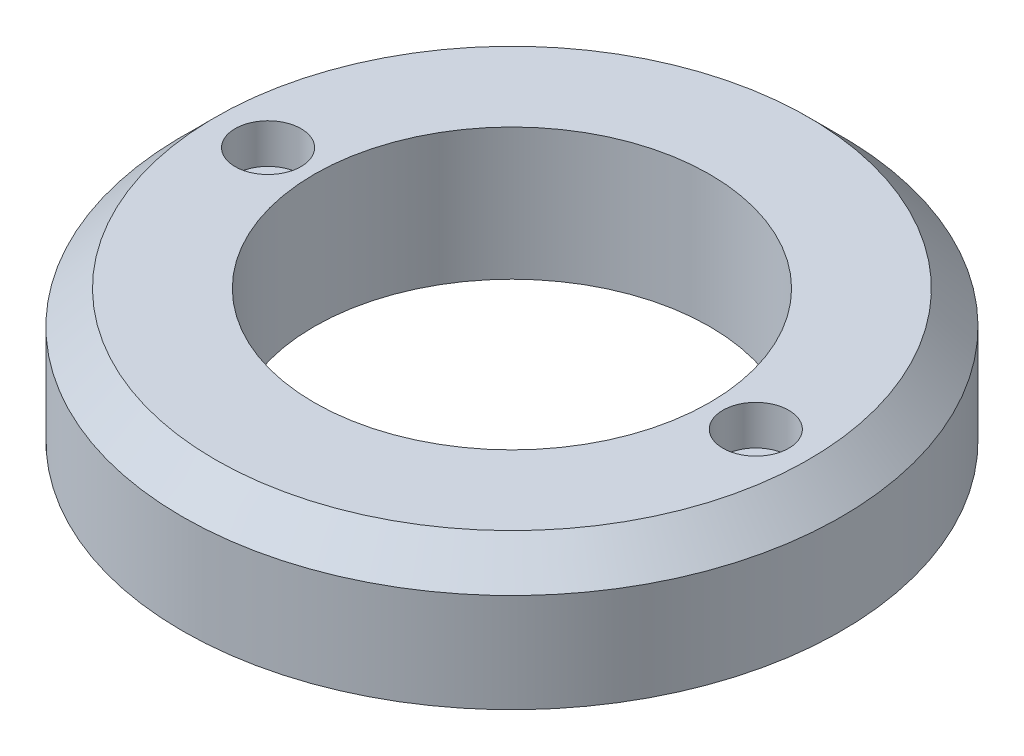
ISO-10303-21;
HEADER;
FILE_DESCRIPTION(('STEP AP214'),'2;1');
FILE_NAME('part.step','',(''),(''),'','','');
FILE_SCHEMA(('AUTOMOTIVE_DESIGN { 1 0 10303 214 1 1 1 1 }'));
ENDSEC;
DATA;
#1=APPLICATION_CONTEXT('core data for automotive mechanical design processes');
#2=APPLICATION_PROTOCOL_DEFINITION('international standard','automotive_design',2000,#1);
#3=PRODUCT_CONTEXT('',#1,'mechanical');
#4=PRODUCT('Part','Part','',(#3));
#5=PRODUCT_RELATED_PRODUCT_CATEGORY('part','',(#4));
#6=PRODUCT_DEFINITION_FORMATION('','',#4);
#7=PRODUCT_DEFINITION_CONTEXT('part definition',#1,'design');
#8=PRODUCT_DEFINITION('design','',#6,#7);
#9=PRODUCT_DEFINITION_SHAPE('','',#8);
#10=(LENGTH_UNIT() NAMED_UNIT(*) SI_UNIT(.MILLI.,.METRE.));
#11=(NAMED_UNIT(*) PLANE_ANGLE_UNIT() SI_UNIT($,.RADIAN.));
#12=(NAMED_UNIT(*) SI_UNIT($,.STERADIAN.) SOLID_ANGLE_UNIT());
#13=UNCERTAINTY_MEASURE_WITH_UNIT(LENGTH_MEASURE(1.E-05),#10,'distance_accuracy_value','');
#14=(GEOMETRIC_REPRESENTATION_CONTEXT(3) GLOBAL_UNCERTAINTY_ASSIGNED_CONTEXT((#13)) GLOBAL_UNIT_ASSIGNED_CONTEXT((#10,
#11,#12)) REPRESENTATION_CONTEXT('',''));
#15=CARTESIAN_POINT('',(0.,0.,0.));
#16=DIRECTION('',(0.,0.,1.));
#17=DIRECTION('',(1.,0.,0.));
#18=AXIS2_PLACEMENT_3D('',#15,#16,#17);
#19=CARTESIAN_POINT('',(37.,20.,0.));
#20=DIRECTION('',(0.,1.,0.));
#21=DIRECTION('',(0.,0.,1.));
#22=AXIS2_PLACEMENT_3D('',#19,#20,#21);
#23=CYLINDRICAL_SURFACE('',#22,2.5);
#24=CARTESIAN_POINT('',(37.,0.,0.));
#25=DIRECTION('',(0.,1.,0.));
#26=DIRECTION('',(0.,0.,1.));
#27=AXIS2_PLACEMENT_3D('',#24,#25,#26);
#28=CIRCLE('',#27,2.5);
#29=CARTESIAN_POINT('',(37.,0.,2.5));
#30=VERTEX_POINT('',#29);
#31=EDGE_CURVE('E69',#30,#30,#28,.T.);
#32=ORIENTED_EDGE('',*,*,#31,.F.);
#33=EDGE_LOOP('',(#32));
#34=FACE_BOUND('',#33,.T.);
#35=CARTESIAN_POINT('',(37.,14.,0.));
#36=DIRECTION('',(0.,1.,0.));
#37=DIRECTION('',(0.,0.,1.));
#38=AXIS2_PLACEMENT_3D('',#35,#36,#37);
#39=CIRCLE('',#38,2.5);
#40=CARTESIAN_POINT('',(37.,14.,2.5));
#41=VERTEX_POINT('',#40);
#42=EDGE_CURVE('E50',#41,#41,#39,.F.);
#43=ORIENTED_EDGE('',*,*,#42,.F.);
#44=EDGE_LOOP('',(#43));
#45=FACE_BOUND('',#44,.T.);
#46=ADVANCED_FACE('F46',(#34,#45),#23,.F.);
#47=CARTESIAN_POINT('',(-37.,20.,-2.77555756156289E-13));
#48=DIRECTION('',(0.,1.,0.));
#49=DIRECTION('',(0.,0.,1.));
#50=AXIS2_PLACEMENT_3D('',#47,#48,#49);
#51=CYLINDRICAL_SURFACE('',#50,2.5);
#52=CARTESIAN_POINT('',(-37.,0.,-2.77555756156289E-13));
#53=DIRECTION('',(0.,1.,0.));
#54=DIRECTION('',(0.,0.,1.));
#55=AXIS2_PLACEMENT_3D('',#52,#53,#54);
#56=CIRCLE('',#55,2.5);
#57=CARTESIAN_POINT('',(-37.,0.,2.49999999999972));
#58=VERTEX_POINT('',#57);
#59=EDGE_CURVE('E64',#58,#58,#56,.T.);
#60=ORIENTED_EDGE('',*,*,#59,.F.);
#61=EDGE_LOOP('',(#60));
#62=FACE_BOUND('',#61,.T.);
#63=CARTESIAN_POINT('',(-37.,14.,-2.77555756156289E-13));
#64=DIRECTION('',(0.,1.,0.));
#65=DIRECTION('',(0.,0.,1.));
#66=AXIS2_PLACEMENT_3D('',#63,#64,#65);
#67=CIRCLE('',#66,2.5);
#68=CARTESIAN_POINT('',(-37.,14.,2.49999999999972));
#69=VERTEX_POINT('',#68);
#70=EDGE_CURVE('E62',#69,#69,#67,.F.);
#71=ORIENTED_EDGE('',*,*,#70,.F.);
#72=EDGE_LOOP('',(#71));
#73=FACE_BOUND('',#72,.T.);
#74=ADVANCED_FACE('F115',(#62,#73),#51,.F.);
#75=CARTESIAN_POINT('',(0.,20.,0.));
#76=DIRECTION('',(0.,1.,0.));
#77=DIRECTION('',(0.,0.,1.));
#78=AXIS2_PLACEMENT_3D('',#75,#76,#77);
#79=PLANE('',#78);
#80=CARTESIAN_POINT('',(37.,20.,0.));
#81=DIRECTION('',(0.,1.,0.));
#82=DIRECTION('',(0.,0.,1.));
#83=AXIS2_PLACEMENT_3D('',#80,#81,#82);
#84=CIRCLE('',#83,5.);
#85=CARTESIAN_POINT('',(37.,20.,5.));
#86=VERTEX_POINT('',#85);
#87=EDGE_CURVE('E79',#86,#86,#84,.T.);
#88=ORIENTED_EDGE('',*,*,#87,.F.);
#89=EDGE_LOOP('',(#88));
#90=FACE_BOUND('',#89,.T.);
#91=CARTESIAN_POINT('',(-37.,20.,-2.77555756156289E-13));
#92=DIRECTION('',(0.,1.,0.));
#93=DIRECTION('',(0.,0.,1.));
#94=AXIS2_PLACEMENT_3D('',#91,#92,#93);
#95=CIRCLE('',#94,5.);
#96=CARTESIAN_POINT('',(-37.,20.,4.99999999999972));
#97=VERTEX_POINT('',#96);
#98=EDGE_CURVE('E72',#97,#97,#95,.T.);
#99=ORIENTED_EDGE('',*,*,#98,.F.);
#100=EDGE_LOOP('',(#99));
#101=FACE_BOUND('',#100,.T.);
#102=CARTESIAN_POINT('',(0.,20.,0.));
#103=DIRECTION('',(0.,1.,0.));
#104=DIRECTION('',(0.,0.,1.));
#105=AXIS2_PLACEMENT_3D('',#102,#103,#104);
#106=CIRCLE('',#105,45.);
#107=CARTESIAN_POINT('',(0.,20.,45.));
#108=VERTEX_POINT('',#107);
#109=EDGE_CURVE('E54',#108,#108,#106,.T.);
#110=ORIENTED_EDGE('',*,*,#109,.T.);
#111=EDGE_LOOP('',(#110));
#112=FACE_BOUND('',#111,.T.);
#113=CARTESIAN_POINT('',(0.,20.,0.));
#114=DIRECTION('',(0.,1.,0.));
#115=DIRECTION('',(0.,0.,1.));
#116=AXIS2_PLACEMENT_3D('',#113,#114,#115);
#117=CIRCLE('',#116,30.);
#118=CARTESIAN_POINT('',(0.,20.,30.));
#119=VERTEX_POINT('',#118);
#120=EDGE_CURVE('E85',#119,#119,#117,.T.);
#121=ORIENTED_EDGE('',*,*,#120,.F.);
#122=EDGE_LOOP('',(#121));
#123=FACE_BOUND('',#122,.T.);
#124=ADVANCED_FACE('F97',(#90,#101,#112,#123),#79,.T.);
#125=CARTESIAN_POINT('',(0.,0.,0.));
#126=DIRECTION('',(0.,1.,0.));
#127=DIRECTION('',(0.,0.,1.));
#128=AXIS2_PLACEMENT_3D('',#125,#126,#127);
#129=PLANE('',#128);
#130=ORIENTED_EDGE('',*,*,#59,.T.);
#131=EDGE_LOOP('',(#130));
#132=FACE_BOUND('',#131,.T.);
#133=ORIENTED_EDGE('',*,*,#31,.T.);
#134=EDGE_LOOP('',(#133));
#135=FACE_BOUND('',#134,.T.);
#136=CARTESIAN_POINT('',(0.,0.,0.));
#137=DIRECTION('',(0.,1.,0.));
#138=DIRECTION('',(0.,0.,1.));
#139=AXIS2_PLACEMENT_3D('',#136,#137,#138);
#140=CIRCLE('',#139,50.);
#141=CARTESIAN_POINT('',(0.,0.,50.));
#142=VERTEX_POINT('',#141);
#143=EDGE_CURVE('E59',#142,#142,#140,.T.);
#144=ORIENTED_EDGE('',*,*,#143,.F.);
#145=EDGE_LOOP('',(#144));
#146=FACE_BOUND('',#145,.T.);
#147=CARTESIAN_POINT('',(0.,0.,0.));
#148=DIRECTION('',(0.,1.,0.));
#149=DIRECTION('',(0.,0.,1.));
#150=AXIS2_PLACEMENT_3D('',#147,#148,#149);
#151=CIRCLE('',#150,30.);
#152=CARTESIAN_POINT('',(0.,0.,30.));
#153=VERTEX_POINT('',#152);
#154=EDGE_CURVE('E84',#153,#153,#151,.T.);
#155=ORIENTED_EDGE('',*,*,#154,.T.);
#156=EDGE_LOOP('',(#155));
#157=FACE_BOUND('',#156,.T.);
#158=ADVANCED_FACE('F94',(#132,#135,#146,#157),#129,.F.);
#159=CARTESIAN_POINT('',(0.,20.,0.));
#160=DIRECTION('',(0.,-1.,0.));
#161=DIRECTION('',(0.,0.,-1.));
#162=AXIS2_PLACEMENT_3D('',#159,#160,#161);
#163=CYLINDRICAL_SURFACE('',#162,50.);
#164=CARTESIAN_POINT('',(0.,15.,0.));
#165=DIRECTION('',(0.,1.,0.));
#166=DIRECTION('',(0.,0.,1.));
#167=AXIS2_PLACEMENT_3D('',#164,#165,#166);
#168=CIRCLE('',#167,50.);
#169=CARTESIAN_POINT('',(0.,15.,50.));
#170=VERTEX_POINT('',#169);
#171=EDGE_CURVE('E12',#170,#170,#168,.F.);
#172=ORIENTED_EDGE('',*,*,#171,.T.);
#173=EDGE_LOOP('',(#172));
#174=FACE_BOUND('',#173,.T.);
#175=ORIENTED_EDGE('',*,*,#143,.T.);
#176=EDGE_LOOP('',(#175));
#177=FACE_BOUND('',#176,.T.);
#178=ADVANCED_FACE('F92',(#174,#177),#163,.T.);
#179=CARTESIAN_POINT('',(0.,20.,0.));
#180=DIRECTION('',(0.,-1.,0.));
#181=DIRECTION('',(0.,0.,-1.));
#182=AXIS2_PLACEMENT_3D('',#179,#180,#181);
#183=CYLINDRICAL_SURFACE('',#182,30.);
#184=ORIENTED_EDGE('',*,*,#120,.T.);
#185=EDGE_LOOP('',(#184));
#186=FACE_BOUND('',#185,.T.);
#187=ORIENTED_EDGE('',*,*,#154,.F.);
#188=EDGE_LOOP('',(#187));
#189=FACE_BOUND('',#188,.T.);
#190=ADVANCED_FACE('F102',(#186,#189),#183,.F.);
#191=CARTESIAN_POINT('',(0.,20.,0.));
#192=DIRECTION('',(0.,-1.,0.));
#193=DIRECTION('',(0.,0.,-1.));
#194=AXIS2_PLACEMENT_3D('',#191,#192,#193);
#195=CONICAL_SURFACE('',#194,45.,0.785398163397443);
#196=ORIENTED_EDGE('',*,*,#171,.F.);
#197=EDGE_LOOP('',(#196));
#198=FACE_BOUND('',#197,.T.);
#199=ORIENTED_EDGE('',*,*,#109,.F.);
#200=EDGE_LOOP('',(#199));
#201=FACE_BOUND('',#200,.T.);
#202=ADVANCED_FACE('F48',(#198,#201),#195,.T.);
#203=CARTESIAN_POINT('',(-37.,14.,-2.77555756156289E-13));
#204=DIRECTION('',(0.,1.,0.));
#205=DIRECTION('',(0.,0.,1.));
#206=AXIS2_PLACEMENT_3D('',#203,#204,#205);
#207=PLANE('',#206);
#208=CARTESIAN_POINT('',(-37.,14.,-2.77555756156289E-13));
#209=DIRECTION('',(0.,1.,0.));
#210=DIRECTION('',(0.,0.,1.));
#211=AXIS2_PLACEMENT_3D('',#208,#209,#210);
#212=CIRCLE('',#211,5.);
#213=CARTESIAN_POINT('',(-37.,14.,4.99999999999972));
#214=VERTEX_POINT('',#213);
#215=EDGE_CURVE('E65',#214,#214,#212,.T.);
#216=ORIENTED_EDGE('',*,*,#215,.T.);
#217=EDGE_LOOP('',(#216));
#218=FACE_BOUND('',#217,.T.);
#219=ORIENTED_EDGE('',*,*,#70,.T.);
#220=EDGE_LOOP('',(#219));
#221=FACE_BOUND('',#220,.T.);
#222=ADVANCED_FACE('F110',(#218,#221),#207,.T.);
#223=CARTESIAN_POINT('',(-37.,14.,-2.77555756156289E-13));
#224=DIRECTION('',(0.,1.,0.));
#225=DIRECTION('',(0.,0.,1.));
#226=AXIS2_PLACEMENT_3D('',#223,#224,#225);
#227=CYLINDRICAL_SURFACE('',#226,5.);
#228=ORIENTED_EDGE('',*,*,#215,.F.);
#229=EDGE_LOOP('',(#228));
#230=FACE_BOUND('',#229,.T.);
#231=ORIENTED_EDGE('',*,*,#98,.T.);
#232=EDGE_LOOP('',(#231));
#233=FACE_BOUND('',#232,.T.);
#234=ADVANCED_FACE('F125',(#230,#233),#227,.F.);
#235=CARTESIAN_POINT('',(37.,14.,0.));
#236=DIRECTION('',(0.,1.,0.));
#237=DIRECTION('',(0.,0.,1.));
#238=AXIS2_PLACEMENT_3D('',#235,#236,#237);
#239=PLANE('',#238);
#240=CARTESIAN_POINT('',(37.,14.,0.));
#241=DIRECTION('',(0.,1.,0.));
#242=DIRECTION('',(0.,0.,1.));
#243=AXIS2_PLACEMENT_3D('',#240,#241,#242);
#244=CIRCLE('',#243,5.);
#245=CARTESIAN_POINT('',(37.,14.,5.));
#246=VERTEX_POINT('',#245);
#247=EDGE_CURVE('E143',#246,#246,#244,.T.);
#248=ORIENTED_EDGE('',*,*,#247,.T.);
#249=EDGE_LOOP('',(#248));
#250=FACE_BOUND('',#249,.T.);
#251=ORIENTED_EDGE('',*,*,#42,.T.);
#252=EDGE_LOOP('',(#251));
#253=FACE_BOUND('',#252,.T.);
#254=ADVANCED_FACE('F128',(#250,#253),#239,.T.);
#255=CARTESIAN_POINT('',(37.,14.,0.));
#256=DIRECTION('',(0.,1.,0.));
#257=DIRECTION('',(0.,0.,1.));
#258=AXIS2_PLACEMENT_3D('',#255,#256,#257);
#259=CYLINDRICAL_SURFACE('',#258,5.);
#260=ORIENTED_EDGE('',*,*,#247,.F.);
#261=EDGE_LOOP('',(#260));
#262=FACE_BOUND('',#261,.T.);
#263=ORIENTED_EDGE('',*,*,#87,.T.);
#264=EDGE_LOOP('',(#263));
#265=FACE_BOUND('',#264,.T.);
#266=ADVANCED_FACE('F132',(#262,#265),#259,.F.);
#267=CLOSED_SHELL('',(#46,#74,#124,#158,#178,#190,#202,#222,#234,#254,#266));
#268=MANIFOLD_SOLID_BREP('B2',#267);
#269=ADVANCED_BREP_SHAPE_REPRESENTATION('',(#18,#268),#14);
#270=SHAPE_DEFINITION_REPRESENTATION(#9,#269);
ENDSEC;
END-ISO-10303-21;
